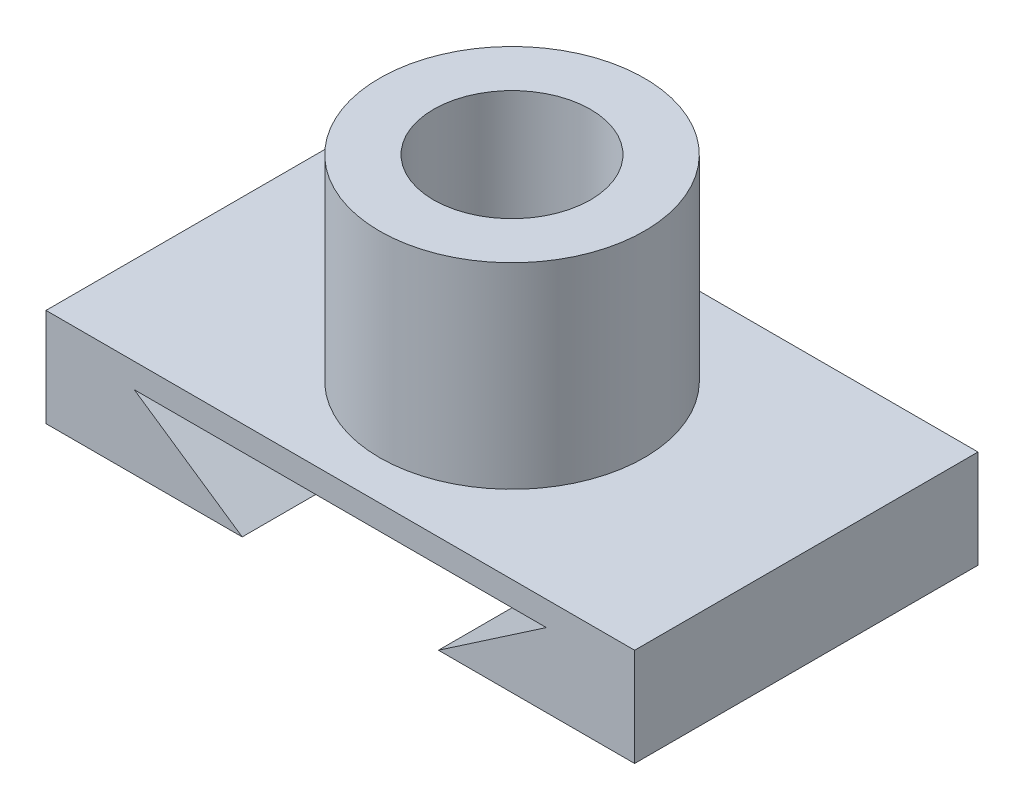
ISO-10303-21;
HEADER;
FILE_DESCRIPTION(('STEP AP214'),'2;1');
FILE_NAME('part.step','',(''),(''),'','','');
FILE_SCHEMA(('AUTOMOTIVE_DESIGN { 1 0 10303 214 1 1 1 1 }'));
ENDSEC;
DATA;
#1=APPLICATION_CONTEXT('core data for automotive mechanical design processes');
#2=APPLICATION_PROTOCOL_DEFINITION('international standard','automotive_design',2000,#1);
#3=PRODUCT_CONTEXT('',#1,'mechanical');
#4=PRODUCT('Part','Part','',(#3));
#5=PRODUCT_RELATED_PRODUCT_CATEGORY('part','',(#4));
#6=PRODUCT_DEFINITION_FORMATION('','',#4);
#7=PRODUCT_DEFINITION_CONTEXT('part definition',#1,'design');
#8=PRODUCT_DEFINITION('design','',#6,#7);
#9=PRODUCT_DEFINITION_SHAPE('','',#8);
#10=(LENGTH_UNIT() NAMED_UNIT(*) SI_UNIT(.MILLI.,.METRE.));
#11=(NAMED_UNIT(*) PLANE_ANGLE_UNIT() SI_UNIT($,.RADIAN.));
#12=(NAMED_UNIT(*) SI_UNIT($,.STERADIAN.) SOLID_ANGLE_UNIT());
#13=UNCERTAINTY_MEASURE_WITH_UNIT(LENGTH_MEASURE(1.E-05),#10,'distance_accuracy_value','');
#14=(GEOMETRIC_REPRESENTATION_CONTEXT(3) GLOBAL_UNCERTAINTY_ASSIGNED_CONTEXT((#13)) GLOBAL_UNIT_ASSIGNED_CONTEXT((#10,
#11,#12)) REPRESENTATION_CONTEXT('',''));
#15=CARTESIAN_POINT('',(0.,0.,0.));
#16=DIRECTION('',(0.,0.,1.));
#17=DIRECTION('',(1.,0.,0.));
#18=AXIS2_PLACEMENT_3D('',#15,#16,#17);
#19=CARTESIAN_POINT('',(0.,5.,35.));
#20=DIRECTION('',(0.,1.,0.));
#21=DIRECTION('',(0.,0.,1.));
#22=AXIS2_PLACEMENT_3D('',#19,#20,#21);
#23=PLANE('',#22);
#24=DIRECTION('',(1.,0.,0.));
#25=VECTOR('',#24,1.);
#26=CARTESIAN_POINT('',(0.,5.,0.));
#27=LINE('',#26,#25);
#28=CARTESIAN_POINT('',(-30.,5.,0.));
#29=VERTEX_POINT('',#28);
#30=CARTESIAN_POINT('',(30.,5.,0.));
#31=VERTEX_POINT('',#30);
#32=EDGE_CURVE('E114',#29,#31,#27,.T.);
#33=ORIENTED_EDGE('',*,*,#32,.F.);
#34=DIRECTION('',(0.,0.,-1.));
#35=VECTOR('',#34,1.);
#36=CARTESIAN_POINT('',(-30.,5.,35.));
#37=LINE('',#36,#35);
#38=CARTESIAN_POINT('',(-30.,5.,35.));
#39=VERTEX_POINT('',#38);
#40=EDGE_CURVE('E109',#39,#29,#37,.T.);
#41=ORIENTED_EDGE('',*,*,#40,.F.);
#42=DIRECTION('',(1.,0.,0.));
#43=VECTOR('',#42,1.);
#44=CARTESIAN_POINT('',(0.,5.,35.));
#45=LINE('',#44,#43);
#46=CARTESIAN_POINT('',(30.,5.,35.));
#47=VERTEX_POINT('',#46);
#48=EDGE_CURVE('E112',#39,#47,#45,.T.);
#49=ORIENTED_EDGE('',*,*,#48,.T.);
#50=DIRECTION('',(0.,0.,-1.));
#51=VECTOR('',#50,1.);
#52=CARTESIAN_POINT('',(30.,5.,35.));
#53=LINE('',#52,#51);
#54=EDGE_CURVE('E119',#47,#31,#53,.T.);
#55=ORIENTED_EDGE('',*,*,#54,.T.);
#56=EDGE_LOOP('',(#33,#41,#49,#55));
#57=FACE_BOUND('',#56,.T.);
#58=CARTESIAN_POINT('',(0.,5.,17.5));
#59=DIRECTION('',(0.,1.,0.));
#60=DIRECTION('',(0.,0.,1.));
#61=AXIS2_PLACEMENT_3D('',#58,#59,#60);
#62=CIRCLE('',#61,13.5);
#63=CARTESIAN_POINT('',(0.,5.,31.));
#64=VERTEX_POINT('',#63);
#65=EDGE_CURVE('E237',#64,#64,#62,.T.);
#66=ORIENTED_EDGE('',*,*,#65,.F.);
#67=EDGE_LOOP('',(#66));
#68=FACE_BOUND('',#67,.T.);
#69=ADVANCED_FACE('F37',(#57,#68),#23,.T.);
#70=CARTESIAN_POINT('',(-5.50070521861777,-8.06770098730606,35.));
#71=DIRECTION('',(0.56333682464151,0.826227342807548,0.));
#72=DIRECTION('',(-0.826227342807548,0.56333682464151,0.));
#73=AXIS2_PLACEMENT_3D('',#70,#71,#72);
#74=PLANE('',#73);
#75=DIRECTION('',(0.826227342807548,-0.56333682464151,0.));
#76=VECTOR('',#75,1.);
#77=CARTESIAN_POINT('',(-5.50070521861777,-8.06770098730606,0.));
#78=LINE('',#77,#76);
#79=CARTESIAN_POINT('',(-21.,2.5,0.));
#80=VERTEX_POINT('',#79);
#81=CARTESIAN_POINT('',(-9.99999999999999,-5.,0.));
#82=VERTEX_POINT('',#81);
#83=EDGE_CURVE('E133',#80,#82,#78,.T.);
#84=ORIENTED_EDGE('',*,*,#83,.F.);
#85=DIRECTION('',(0.,0.,-1.));
#86=VECTOR('',#85,1.);
#87=CARTESIAN_POINT('',(-21.,2.5,35.));
#88=LINE('',#87,#86);
#89=CARTESIAN_POINT('',(-21.,2.5,35.));
#90=VERTEX_POINT('',#89);
#91=EDGE_CURVE('E46',#90,#80,#88,.T.);
#92=ORIENTED_EDGE('',*,*,#91,.F.);
#93=DIRECTION('',(0.826227342807548,-0.56333682464151,0.));
#94=VECTOR('',#93,1.);
#95=CARTESIAN_POINT('',(-5.50070521861777,-8.06770098730606,35.));
#96=LINE('',#95,#94);
#97=CARTESIAN_POINT('',(-9.99999999999999,-5.,35.));
#98=VERTEX_POINT('',#97);
#99=EDGE_CURVE('E235',#90,#98,#96,.T.);
#100=ORIENTED_EDGE('',*,*,#99,.T.);
#101=DIRECTION('',(0.,0.,-1.));
#102=VECTOR('',#101,1.);
#103=CARTESIAN_POINT('',(-9.99999999999999,-5.,35.));
#104=LINE('',#103,#102);
#105=EDGE_CURVE('E89',#98,#82,#104,.T.);
#106=ORIENTED_EDGE('',*,*,#105,.T.);
#107=EDGE_LOOP('',(#84,#92,#100,#106));
#108=FACE_BOUND('',#107,.T.);
#109=ADVANCED_FACE('F39',(#108),#74,.T.);
#110=CARTESIAN_POINT('',(0.,2.5,35.));
#111=DIRECTION('',(0.,1.,0.));
#112=DIRECTION('',(-1.,0.,0.));
#113=AXIS2_PLACEMENT_3D('',#110,#111,#112);
#114=PLANE('',#113);
#115=DIRECTION('',(1.,0.,0.));
#116=VECTOR('',#115,1.);
#117=CARTESIAN_POINT('',(0.,2.5,0.));
#118=LINE('',#117,#116);
#119=CARTESIAN_POINT('',(21.,2.5,0.));
#120=VERTEX_POINT('',#119);
#121=EDGE_CURVE('E136',#80,#120,#118,.T.);
#122=ORIENTED_EDGE('',*,*,#121,.T.);
#123=DIRECTION('',(0.,0.,-1.));
#124=VECTOR('',#123,1.);
#125=CARTESIAN_POINT('',(21.,2.5,35.));
#126=LINE('',#125,#124);
#127=CARTESIAN_POINT('',(21.,2.5,35.));
#128=VERTEX_POINT('',#127);
#129=EDGE_CURVE('E159',#128,#120,#126,.T.);
#130=ORIENTED_EDGE('',*,*,#129,.F.);
#131=DIRECTION('',(1.,0.,0.));
#132=VECTOR('',#131,1.);
#133=CARTESIAN_POINT('',(0.,2.5,35.));
#134=LINE('',#133,#132);
#135=EDGE_CURVE('E165',#90,#128,#134,.T.);
#136=ORIENTED_EDGE('',*,*,#135,.F.);
#137=ORIENTED_EDGE('',*,*,#91,.T.);
#138=EDGE_LOOP('',(#122,#130,#136,#137));
#139=FACE_BOUND('',#138,.T.);
#140=ADVANCED_FACE('F163',(#139),#114,.F.);
#141=CARTESIAN_POINT('',(5.50070521861777,-8.06770098730606,35.));
#142=DIRECTION('',(0.56333682464151,-0.826227342807548,0.));
#143=DIRECTION('',(0.826227342807548,0.56333682464151,0.));
#144=AXIS2_PLACEMENT_3D('',#141,#142,#143);
#145=PLANE('',#144);
#146=DIRECTION('',(-0.826227342807548,-0.56333682464151,0.));
#147=VECTOR('',#146,1.);
#148=CARTESIAN_POINT('',(5.50070521861777,-8.06770098730606,0.));
#149=LINE('',#148,#147);
#150=CARTESIAN_POINT('',(10.,-5.,0.));
#151=VERTEX_POINT('',#150);
#152=EDGE_CURVE('E139',#120,#151,#149,.T.);
#153=ORIENTED_EDGE('',*,*,#152,.T.);
#154=DIRECTION('',(0.,0.,-1.));
#155=VECTOR('',#154,1.);
#156=CARTESIAN_POINT('',(10.,-5.,35.));
#157=LINE('',#156,#155);
#158=CARTESIAN_POINT('',(10.,-5.,35.));
#159=VERTEX_POINT('',#158);
#160=EDGE_CURVE('E156',#159,#151,#157,.T.);
#161=ORIENTED_EDGE('',*,*,#160,.F.);
#162=DIRECTION('',(-0.826227342807548,-0.56333682464151,0.));
#163=VECTOR('',#162,1.);
#164=CARTESIAN_POINT('',(5.50070521861777,-8.06770098730606,35.));
#165=LINE('',#164,#163);
#166=EDGE_CURVE('E231',#128,#159,#165,.T.);
#167=ORIENTED_EDGE('',*,*,#166,.F.);
#168=ORIENTED_EDGE('',*,*,#129,.T.);
#169=EDGE_LOOP('',(#153,#161,#167,#168));
#170=FACE_BOUND('',#169,.T.);
#171=ADVANCED_FACE('F175',(#170),#145,.F.);
#172=CARTESIAN_POINT('',(0.,-5.,35.));
#173=DIRECTION('',(0.,1.,0.));
#174=DIRECTION('',(0.,0.,1.));
#175=AXIS2_PLACEMENT_3D('',#172,#173,#174);
#176=PLANE('',#175);
#177=DIRECTION('',(1.,0.,0.));
#178=VECTOR('',#177,1.);
#179=CARTESIAN_POINT('',(0.,-5.,0.));
#180=LINE('',#179,#178);
#181=CARTESIAN_POINT('',(30.,-5.,0.));
#182=VERTEX_POINT('',#181);
#183=EDGE_CURVE('E141',#151,#182,#180,.T.);
#184=ORIENTED_EDGE('',*,*,#183,.T.);
#185=DIRECTION('',(0.,0.,-1.));
#186=VECTOR('',#185,1.);
#187=CARTESIAN_POINT('',(30.,-5.,35.));
#188=LINE('',#187,#186);
#189=CARTESIAN_POINT('',(30.,-5.,35.));
#190=VERTEX_POINT('',#189);
#191=EDGE_CURVE('E153',#190,#182,#188,.T.);
#192=ORIENTED_EDGE('',*,*,#191,.F.);
#193=DIRECTION('',(1.,0.,0.));
#194=VECTOR('',#193,1.);
#195=CARTESIAN_POINT('',(0.,-5.,35.));
#196=LINE('',#195,#194);
#197=EDGE_CURVE('E130',#159,#190,#196,.T.);
#198=ORIENTED_EDGE('',*,*,#197,.F.);
#199=ORIENTED_EDGE('',*,*,#160,.T.);
#200=EDGE_LOOP('',(#184,#192,#198,#199));
#201=FACE_BOUND('',#200,.T.);
#202=ADVANCED_FACE('F210',(#201),#176,.F.);
#203=CARTESIAN_POINT('',(30.,0.,35.));
#204=DIRECTION('',(-1.,0.,0.));
#205=DIRECTION('',(0.,0.,1.));
#206=AXIS2_PLACEMENT_3D('',#203,#204,#205);
#207=PLANE('',#206);
#208=DIRECTION('',(0.,1.,0.));
#209=VECTOR('',#208,1.);
#210=CARTESIAN_POINT('',(30.,0.,0.));
#211=LINE('',#210,#209);
#212=EDGE_CURVE('E143',#182,#31,#211,.T.);
#213=ORIENTED_EDGE('',*,*,#212,.T.);
#214=ORIENTED_EDGE('',*,*,#54,.F.);
#215=DIRECTION('',(0.,1.,0.));
#216=VECTOR('',#215,1.);
#217=CARTESIAN_POINT('',(30.,0.,35.));
#218=LINE('',#217,#216);
#219=EDGE_CURVE('E124',#190,#47,#218,.T.);
#220=ORIENTED_EDGE('',*,*,#219,.F.);
#221=ORIENTED_EDGE('',*,*,#191,.T.);
#222=EDGE_LOOP('',(#213,#214,#220,#221));
#223=FACE_BOUND('',#222,.T.);
#224=ADVANCED_FACE('F212',(#223),#207,.F.);
#225=CARTESIAN_POINT('',(-30.,0.,35.));
#226=DIRECTION('',(-1.,0.,0.));
#227=DIRECTION('',(0.,0.,1.));
#228=AXIS2_PLACEMENT_3D('',#225,#226,#227);
#229=PLANE('',#228);
#230=DIRECTION('',(0.,1.,0.));
#231=VECTOR('',#230,1.);
#232=CARTESIAN_POINT('',(-30.,0.,0.));
#233=LINE('',#232,#231);
#234=CARTESIAN_POINT('',(-30.,-5.,0.));
#235=VERTEX_POINT('',#234);
#236=EDGE_CURVE('E148',#235,#29,#233,.T.);
#237=ORIENTED_EDGE('',*,*,#236,.F.);
#238=DIRECTION('',(0.,0.,-1.));
#239=VECTOR('',#238,1.);
#240=CARTESIAN_POINT('',(-30.,-5.,35.));
#241=LINE('',#240,#239);
#242=CARTESIAN_POINT('',(-30.,-5.,35.));
#243=VERTEX_POINT('',#242);
#244=EDGE_CURVE('E82',#243,#235,#241,.T.);
#245=ORIENTED_EDGE('',*,*,#244,.F.);
#246=DIRECTION('',(0.,1.,0.));
#247=VECTOR('',#246,1.);
#248=CARTESIAN_POINT('',(-30.,0.,35.));
#249=LINE('',#248,#247);
#250=EDGE_CURVE('E122',#243,#39,#249,.T.);
#251=ORIENTED_EDGE('',*,*,#250,.T.);
#252=ORIENTED_EDGE('',*,*,#40,.T.);
#253=EDGE_LOOP('',(#237,#245,#251,#252));
#254=FACE_BOUND('',#253,.T.);
#255=ADVANCED_FACE('F127',(#254),#229,.T.);
#256=EDGE_CURVE('E144',#235,#82,#180,.T.);
#257=ORIENTED_EDGE('',*,*,#256,.T.);
#258=ORIENTED_EDGE('',*,*,#105,.F.);
#259=EDGE_CURVE('E54',#243,#98,#196,.T.);
#260=ORIENTED_EDGE('',*,*,#259,.F.);
#261=ORIENTED_EDGE('',*,*,#244,.T.);
#262=EDGE_LOOP('',(#257,#258,#260,#261));
#263=FACE_BOUND('',#262,.T.);
#264=ADVANCED_FACE('F206',(#263),#176,.F.);
#265=CARTESIAN_POINT('',(0.,0.,35.));
#266=DIRECTION('',(0.,0.,1.));
#267=DIRECTION('',(1.,0.,0.));
#268=AXIS2_PLACEMENT_3D('',#265,#266,#267);
#269=PLANE('',#268);
#270=ORIENTED_EDGE('',*,*,#99,.F.);
#271=ORIENTED_EDGE('',*,*,#135,.T.);
#272=ORIENTED_EDGE('',*,*,#166,.T.);
#273=ORIENTED_EDGE('',*,*,#197,.T.);
#274=ORIENTED_EDGE('',*,*,#219,.T.);
#275=ORIENTED_EDGE('',*,*,#48,.F.);
#276=ORIENTED_EDGE('',*,*,#250,.F.);
#277=ORIENTED_EDGE('',*,*,#259,.T.);
#278=EDGE_LOOP('',(#270,#271,#272,#273,#274,#275,#276,#277));
#279=FACE_BOUND('',#278,.T.);
#280=ADVANCED_FACE('F121',(#279),#269,.T.);
#281=CARTESIAN_POINT('',(0.,0.,0.));
#282=DIRECTION('',(0.,0.,1.));
#283=DIRECTION('',(1.,0.,0.));
#284=AXIS2_PLACEMENT_3D('',#281,#282,#283);
#285=PLANE('',#284);
#286=ORIENTED_EDGE('',*,*,#83,.T.);
#287=ORIENTED_EDGE('',*,*,#256,.F.);
#288=ORIENTED_EDGE('',*,*,#236,.T.);
#289=ORIENTED_EDGE('',*,*,#32,.T.);
#290=ORIENTED_EDGE('',*,*,#212,.F.);
#291=ORIENTED_EDGE('',*,*,#183,.F.);
#292=ORIENTED_EDGE('',*,*,#152,.F.);
#293=ORIENTED_EDGE('',*,*,#121,.F.);
#294=EDGE_LOOP('',(#286,#287,#288,#289,#290,#291,#292,#293));
#295=FACE_BOUND('',#294,.T.);
#296=ADVANCED_FACE('F168',(#295),#285,.F.);
#297=CARTESIAN_POINT('',(0.,25.,17.5));
#298=DIRECTION('',(0.,1.,0.));
#299=DIRECTION('',(0.,0.,1.));
#300=AXIS2_PLACEMENT_3D('',#297,#298,#299);
#301=PLANE('',#300);
#302=CARTESIAN_POINT('',(0.,25.,17.5));
#303=DIRECTION('',(0.,1.,0.));
#304=DIRECTION('',(0.,0.,1.));
#305=AXIS2_PLACEMENT_3D('',#302,#303,#304);
#306=CIRCLE('',#305,13.5);
#307=CARTESIAN_POINT('',(0.,25.,31.));
#308=VERTEX_POINT('',#307);
#309=EDGE_CURVE('E137',#308,#308,#306,.T.);
#310=ORIENTED_EDGE('',*,*,#309,.T.);
#311=EDGE_LOOP('',(#310));
#312=FACE_BOUND('',#311,.T.);
#313=CARTESIAN_POINT('',(0.,25.,17.5));
#314=DIRECTION('',(0.,1.,0.));
#315=DIRECTION('',(0.,0.,1.));
#316=AXIS2_PLACEMENT_3D('',#313,#314,#315);
#317=CIRCLE('',#316,8.);
#318=CARTESIAN_POINT('',(0.,25.,25.5));
#319=VERTEX_POINT('',#318);
#320=EDGE_CURVE('E240',#319,#319,#317,.T.);
#321=ORIENTED_EDGE('',*,*,#320,.F.);
#322=EDGE_LOOP('',(#321));
#323=FACE_BOUND('',#322,.T.);
#324=ADVANCED_FACE('F196',(#312,#323),#301,.T.);
#325=CARTESIAN_POINT('',(0.,25.,17.5));
#326=DIRECTION('',(0.,-1.,0.));
#327=DIRECTION('',(0.,0.,-1.));
#328=AXIS2_PLACEMENT_3D('',#325,#326,#327);
#329=CYLINDRICAL_SURFACE('',#328,13.5);
#330=ORIENTED_EDGE('',*,*,#309,.F.);
#331=EDGE_LOOP('',(#330));
#332=FACE_BOUND('',#331,.T.);
#333=ORIENTED_EDGE('',*,*,#65,.T.);
#334=EDGE_LOOP('',(#333));
#335=FACE_BOUND('',#334,.T.);
#336=ADVANCED_FACE('F188',(#332,#335),#329,.T.);
#337=CARTESIAN_POINT('',(0.,25.,17.5));
#338=DIRECTION('',(0.,-1.,0.));
#339=DIRECTION('',(0.,0.,-1.));
#340=AXIS2_PLACEMENT_3D('',#337,#338,#339);
#341=CYLINDRICAL_SURFACE('',#340,8.);
#342=ORIENTED_EDGE('',*,*,#320,.T.);
#343=EDGE_LOOP('',(#342));
#344=FACE_BOUND('',#343,.T.);
#345=CARTESIAN_POINT('',(0.,5.,17.5));
#346=DIRECTION('',(0.,1.,0.));
#347=DIRECTION('',(0.,0.,1.));
#348=AXIS2_PLACEMENT_3D('',#345,#346,#347);
#349=CIRCLE('',#348,8.);
#350=CARTESIAN_POINT('',(0.,5.,25.5));
#351=VERTEX_POINT('',#350);
#352=EDGE_CURVE('E11',#351,#351,#349,.F.);
#353=ORIENTED_EDGE('',*,*,#352,.T.);
#354=EDGE_LOOP('',(#353));
#355=FACE_BOUND('',#354,.T.);
#356=ADVANCED_FACE('F183',(#344,#355),#341,.F.);
#357=ORIENTED_EDGE('',*,*,#352,.F.);
#358=EDGE_LOOP('',(#357));
#359=FACE_BOUND('',#358,.T.);
#360=ADVANCED_FACE('F177',(#359),#23,.T.);
#361=CLOSED_SHELL('',(#69,#109,#140,#171,#202,#224,#255,#264,#280,#296,#324,#336,#356,#360));
#362=MANIFOLD_SOLID_BREP('B2',#361);
#363=ADVANCED_BREP_SHAPE_REPRESENTATION('',(#18,#362),#14);
#364=SHAPE_DEFINITION_REPRESENTATION(#9,#363);
ENDSEC;
END-ISO-10303-21;
